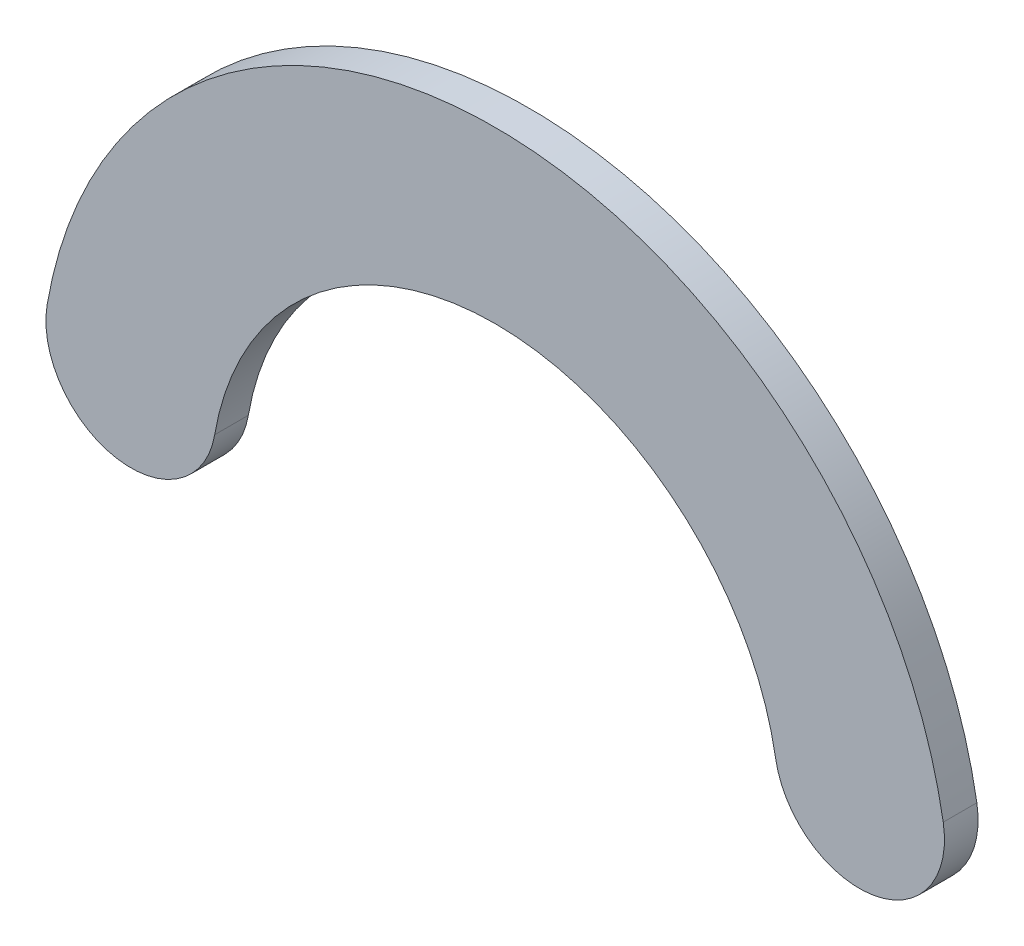
ISO-10303-21;
HEADER;
FILE_DESCRIPTION(('STEP AP214'),'2;1');
FILE_NAME('part.step','',(''),(''),'','','');
FILE_SCHEMA(('AUTOMOTIVE_DESIGN { 1 0 10303 214 1 1 1 1 }'));
ENDSEC;
DATA;
#1=APPLICATION_CONTEXT('core data for automotive mechanical design processes');
#2=APPLICATION_PROTOCOL_DEFINITION('international standard','automotive_design',2000,#1);
#3=PRODUCT_CONTEXT('',#1,'mechanical');
#4=PRODUCT('Part','Part','',(#3));
#5=PRODUCT_RELATED_PRODUCT_CATEGORY('part','',(#4));
#6=PRODUCT_DEFINITION_FORMATION('','',#4);
#7=PRODUCT_DEFINITION_CONTEXT('part definition',#1,'design');
#8=PRODUCT_DEFINITION('design','',#6,#7);
#9=PRODUCT_DEFINITION_SHAPE('','',#8);
#10=(LENGTH_UNIT() NAMED_UNIT(*) SI_UNIT(.MILLI.,.METRE.));
#11=(NAMED_UNIT(*) PLANE_ANGLE_UNIT() SI_UNIT($,.RADIAN.));
#12=(NAMED_UNIT(*) SI_UNIT($,.STERADIAN.) SOLID_ANGLE_UNIT());
#13=UNCERTAINTY_MEASURE_WITH_UNIT(LENGTH_MEASURE(1.E-05),#10,'distance_accuracy_value','');
#14=(GEOMETRIC_REPRESENTATION_CONTEXT(3) GLOBAL_UNCERTAINTY_ASSIGNED_CONTEXT((#13)) GLOBAL_UNIT_ASSIGNED_CONTEXT((#10,
#11,#12)) REPRESENTATION_CONTEXT('',''));
#15=CARTESIAN_POINT('',(0.,0.,0.));
#16=DIRECTION('',(0.,0.,1.));
#17=DIRECTION('',(1.,0.,0.));
#18=AXIS2_PLACEMENT_3D('',#15,#16,#17);
#19=CARTESIAN_POINT('',(70.9227290232849,12.3320617397998,5.));
#20=DIRECTION('',(0.,0.,-1.));
#21=DIRECTION('',(-1.,0.,0.));
#22=AXIS2_PLACEMENT_3D('',#19,#20,#21);
#23=CYLINDRICAL_SURFACE('',#22,12.6377037803664);
#24=CARTESIAN_POINT('',(70.9227290232849,12.3320617397998,0.));
#25=DIRECTION('',(0.,0.,1.));
#26=DIRECTION('',(1.,0.,0.));
#27=AXIS2_PLACEMENT_3D('',#24,#25,#26);
#28=CIRCLE('',#27,12.6377037803664);
#29=CARTESIAN_POINT('',(58.4670074867854,10.1951111448002,0.));
#30=VERTEX_POINT('',#29);
#31=CARTESIAN_POINT('',(83.3784505597845,14.4690123347995,0.));
#32=VERTEX_POINT('',#31);
#33=EDGE_CURVE('E147',#30,#32,#28,.T.);
#34=ORIENTED_EDGE('',*,*,#33,.T.);
#35=DIRECTION('',(0.,0.,-1.));
#36=VECTOR('',#35,1.);
#37=CARTESIAN_POINT('',(83.3784505597845,14.4690123347995,5.));
#38=LINE('',#37,#36);
#39=CARTESIAN_POINT('',(83.3784505597845,14.4690123347995,5.));
#40=VERTEX_POINT('',#39);
#41=EDGE_CURVE('E11',#40,#32,#38,.T.);
#42=ORIENTED_EDGE('',*,*,#41,.F.);
#43=CARTESIAN_POINT('',(70.9227290232849,12.3320617397998,5.));
#44=DIRECTION('',(0.,0.,1.));
#45=DIRECTION('',(1.,0.,0.));
#46=AXIS2_PLACEMENT_3D('',#43,#44,#45);
#47=CIRCLE('',#46,12.6377037803664);
#48=CARTESIAN_POINT('',(58.4670074867854,10.1951111448002,5.));
#49=VERTEX_POINT('',#48);
#50=EDGE_CURVE('E151',#49,#40,#47,.T.);
#51=ORIENTED_EDGE('',*,*,#50,.F.);
#52=DIRECTION('',(0.,0.,-1.));
#53=VECTOR('',#52,1.);
#54=CARTESIAN_POINT('',(58.4670074867854,10.1951111448002,5.));
#55=LINE('',#54,#53);
#56=EDGE_CURVE('E157',#49,#30,#55,.T.);
#57=ORIENTED_EDGE('',*,*,#56,.T.);
#58=EDGE_LOOP('',(#34,#42,#51,#57));
#59=FACE_BOUND('',#58,.T.);
#60=ADVANCED_FACE('F39',(#59),#23,.T.);
#61=CARTESIAN_POINT('',(16.7688926876421,3.04122520015393,5.));
#62=DIRECTION('',(0.,0.,-1.));
#63=DIRECTION('',(-1.,0.,0.));
#64=AXIS2_PLACEMENT_3D('',#61,#62,#63);
#65=CYLINDRICAL_SURFACE('',#64,67.5827457175058);
#66=CARTESIAN_POINT('',(16.7688926876421,3.04122520015393,0.));
#67=DIRECTION('',(0.,0.,1.));
#68=DIRECTION('',(1.,0.,0.));
#69=AXIS2_PLACEMENT_3D('',#66,#67,#68);
#70=CIRCLE('',#69,67.5827457175058);
#71=CARTESIAN_POINT('',(-49.8406651845002,14.4690123347995,0.));
#72=VERTEX_POINT('',#71);
#73=EDGE_CURVE('E160',#32,#72,#70,.T.);
#74=ORIENTED_EDGE('',*,*,#73,.T.);
#75=DIRECTION('',(0.,0.,-1.));
#76=VECTOR('',#75,1.);
#77=CARTESIAN_POINT('',(-49.8406651845002,14.4690123347995,5.));
#78=LINE('',#77,#76);
#79=CARTESIAN_POINT('',(-49.8406651845002,14.4690123347995,5.));
#80=VERTEX_POINT('',#79);
#81=EDGE_CURVE('E46',#80,#72,#78,.T.);
#82=ORIENTED_EDGE('',*,*,#81,.F.);
#83=CARTESIAN_POINT('',(16.7688926876421,3.04122520015393,5.));
#84=DIRECTION('',(0.,0.,1.));
#85=DIRECTION('',(1.,0.,0.));
#86=AXIS2_PLACEMENT_3D('',#83,#84,#85);
#87=CIRCLE('',#86,67.5827457175058);
#88=EDGE_CURVE('E90',#40,#80,#87,.T.);
#89=ORIENTED_EDGE('',*,*,#88,.F.);
#90=ORIENTED_EDGE('',*,*,#41,.T.);
#91=EDGE_LOOP('',(#74,#82,#89,#90));
#92=FACE_BOUND('',#91,.T.);
#93=ADVANCED_FACE('F188',(#92),#65,.T.);
#94=CARTESIAN_POINT('',(-37.3849436480007,12.3320617397998,5.));
#95=DIRECTION('',(0.,0.,-1.));
#96=DIRECTION('',(-1.,0.,0.));
#97=AXIS2_PLACEMENT_3D('',#94,#95,#96);
#98=CYLINDRICAL_SURFACE('',#97,12.6377037803664);
#99=CARTESIAN_POINT('',(-37.3849436480007,12.3320617397998,0.));
#100=DIRECTION('',(0.,0.,1.));
#101=DIRECTION('',(1.,0.,0.));
#102=AXIS2_PLACEMENT_3D('',#99,#100,#101);
#103=CIRCLE('',#102,12.6377037803664);
#104=CARTESIAN_POINT('',(-24.9292221115011,10.1951111448002,0.));
#105=VERTEX_POINT('',#104);
#106=EDGE_CURVE('E162',#72,#105,#103,.T.);
#107=ORIENTED_EDGE('',*,*,#106,.T.);
#108=DIRECTION('',(0.,0.,-1.));
#109=VECTOR('',#108,1.);
#110=CARTESIAN_POINT('',(-24.9292221115011,10.1951111448002,5.));
#111=LINE('',#110,#109);
#112=CARTESIAN_POINT('',(-24.9292221115011,10.1951111448002,5.));
#113=VERTEX_POINT('',#112);
#114=EDGE_CURVE('E166',#113,#105,#111,.T.);
#115=ORIENTED_EDGE('',*,*,#114,.F.);
#116=CARTESIAN_POINT('',(-37.3849436480007,12.3320617397998,5.));
#117=DIRECTION('',(0.,0.,1.));
#118=DIRECTION('',(1.,0.,0.));
#119=AXIS2_PLACEMENT_3D('',#116,#117,#118);
#120=CIRCLE('',#119,12.6377037803664);
#121=EDGE_CURVE('E154',#80,#113,#120,.T.);
#122=ORIENTED_EDGE('',*,*,#121,.F.);
#123=ORIENTED_EDGE('',*,*,#81,.T.);
#124=EDGE_LOOP('',(#107,#115,#122,#123));
#125=FACE_BOUND('',#124,.T.);
#126=ADVANCED_FACE('F171',(#125),#98,.T.);
#127=CARTESIAN_POINT('',(16.7688926876421,3.04122520015393,5.));
#128=DIRECTION('',(0.,0.,-1.));
#129=DIRECTION('',(-1.,0.,0.));
#130=AXIS2_PLACEMENT_3D('',#127,#128,#129);
#131=CYLINDRICAL_SURFACE('',#130,42.307338156773);
#132=CARTESIAN_POINT('',(16.7688926876421,3.04122520015393,0.));
#133=DIRECTION('',(0.,0.,-1.));
#134=DIRECTION('',(1.,0.,0.));
#135=AXIS2_PLACEMENT_3D('',#132,#133,#134);
#136=CIRCLE('',#135,42.307338156773);
#137=EDGE_CURVE('E83',#105,#30,#136,.T.);
#138=ORIENTED_EDGE('',*,*,#137,.T.);
#139=ORIENTED_EDGE('',*,*,#56,.F.);
#140=CARTESIAN_POINT('',(16.7688926876421,3.04122520015393,5.));
#141=DIRECTION('',(0.,0.,-1.));
#142=DIRECTION('',(1.,0.,0.));
#143=AXIS2_PLACEMENT_3D('',#140,#141,#142);
#144=CIRCLE('',#143,42.307338156773);
#145=EDGE_CURVE('E62',#113,#49,#144,.T.);
#146=ORIENTED_EDGE('',*,*,#145,.F.);
#147=ORIENTED_EDGE('',*,*,#114,.T.);
#148=EDGE_LOOP('',(#138,#139,#146,#147));
#149=FACE_BOUND('',#148,.T.);
#150=ADVANCED_FACE('F179',(#149),#131,.F.);
#151=CARTESIAN_POINT('',(43.8458108554635,7.68664346997689,5.));
#152=DIRECTION('',(0.,0.,1.));
#153=DIRECTION('',(1.,0.,0.));
#154=AXIS2_PLACEMENT_3D('',#151,#152,#153);
#155=PLANE('',#154);
#156=ORIENTED_EDGE('',*,*,#50,.T.);
#157=ORIENTED_EDGE('',*,*,#88,.T.);
#158=ORIENTED_EDGE('',*,*,#121,.T.);
#159=ORIENTED_EDGE('',*,*,#145,.T.);
#160=EDGE_LOOP('',(#156,#157,#158,#159));
#161=FACE_BOUND('',#160,.T.);
#162=ADVANCED_FACE('F181',(#161),#155,.T.);
#163=CARTESIAN_POINT('',(43.8458108554635,7.68664346997689,0.));
#164=DIRECTION('',(0.,0.,1.));
#165=DIRECTION('',(1.,0.,0.));
#166=AXIS2_PLACEMENT_3D('',#163,#164,#165);
#167=PLANE('',#166);
#168=CARTESIAN_POINT('',(16.7688926876421,3.80780695406795,0.));
#169=DIRECTION('',(0.,0.,-1.));
#170=DIRECTION('',(-1.,0.,0.));
#171=AXIS2_PLACEMENT_3D('',#168,#169,#170);
#172=CIRCLE('',#171,64.5028861300054);
#173=CARTESIAN_POINT('',(-46.9494386499588,13.8375911318124,0.));
#174=VERTEX_POINT('',#173);
#175=CARTESIAN_POINT('',(80.4872240252431,13.8375911318125,0.));
#176=VERTEX_POINT('',#175);
#177=EDGE_CURVE('E141',#174,#176,#172,.T.);
#178=ORIENTED_EDGE('',*,*,#177,.F.);
#179=CARTESIAN_POINT('',(-37.3849436480007,12.3320617397998,0.));
#180=DIRECTION('',(0.,0.,-1.));
#181=DIRECTION('',(-1.,0.,0.));
#182=AXIS2_PLACEMENT_3D('',#179,#180,#181);
#183=CIRCLE('',#182,9.68226127475893);
#184=CARTESIAN_POINT('',(-27.8204486460425,10.8265323477872,0.));
#185=VERTEX_POINT('',#184);
#186=EDGE_CURVE('E53',#185,#174,#183,.T.);
#187=ORIENTED_EDGE('',*,*,#186,.F.);
#188=CARTESIAN_POINT('',(16.7688926876421,3.80780695406795,0.));
#189=DIRECTION('',(0.,0.,1.));
#190=DIRECTION('',(-1.,0.,0.));
#191=AXIS2_PLACEMENT_3D('',#188,#189,#190);
#192=CIRCLE('',#191,45.1383635804875);
#193=CARTESIAN_POINT('',(61.3582340213268,10.8265323477873,0.));
#194=VERTEX_POINT('',#193);
#195=EDGE_CURVE('E132',#194,#185,#192,.T.);
#196=ORIENTED_EDGE('',*,*,#195,.F.);
#197=CARTESIAN_POINT('',(70.922729023285,12.3320617397999,0.));
#198=DIRECTION('',(0.,0.,-1.));
#199=DIRECTION('',(-1.,0.,0.));
#200=AXIS2_PLACEMENT_3D('',#197,#198,#199);
#201=CIRCLE('',#200,9.68226127475892);
#202=EDGE_CURVE('E135',#176,#194,#201,.T.);
#203=ORIENTED_EDGE('',*,*,#202,.F.);
#204=EDGE_LOOP('',(#178,#187,#196,#203));
#205=FACE_BOUND('',#204,.T.);
#206=ORIENTED_EDGE('',*,*,#33,.F.);
#207=ORIENTED_EDGE('',*,*,#137,.F.);
#208=ORIENTED_EDGE('',*,*,#106,.F.);
#209=ORIENTED_EDGE('',*,*,#73,.F.);
#210=EDGE_LOOP('',(#206,#207,#208,#209));
#211=FACE_BOUND('',#210,.T.);
#212=ADVANCED_FACE('F175',(#205,#211),#167,.F.);
#213=CARTESIAN_POINT('',(-37.3849436480007,12.3320617397998,3.5));
#214=DIRECTION('',(0.,0.,-1.));
#215=DIRECTION('',(-1.,0.,0.));
#216=AXIS2_PLACEMENT_3D('',#213,#214,#215);
#217=CYLINDRICAL_SURFACE('',#216,9.68226127475893);
#218=ORIENTED_EDGE('',*,*,#186,.T.);
#219=DIRECTION('',(0.,0.,-1.));
#220=VECTOR('',#219,1.);
#221=CARTESIAN_POINT('',(-46.9494386499588,13.8375911318124,3.5));
#222=LINE('',#221,#220);
#223=CARTESIAN_POINT('',(-46.9494386499588,13.8375911318124,3.5));
#224=VERTEX_POINT('',#223);
#225=EDGE_CURVE('E110',#224,#174,#222,.T.);
#226=ORIENTED_EDGE('',*,*,#225,.F.);
#227=CARTESIAN_POINT('',(-37.3849436480007,12.3320617397998,3.5));
#228=DIRECTION('',(0.,0.,-1.));
#229=DIRECTION('',(-1.,0.,0.));
#230=AXIS2_PLACEMENT_3D('',#227,#228,#229);
#231=CIRCLE('',#230,9.68226127475893);
#232=CARTESIAN_POINT('',(-27.8204486460425,10.8265323477872,3.5));
#233=VERTEX_POINT('',#232);
#234=EDGE_CURVE('E114',#233,#224,#231,.T.);
#235=ORIENTED_EDGE('',*,*,#234,.F.);
#236=DIRECTION('',(0.,0.,-1.));
#237=VECTOR('',#236,1.);
#238=CARTESIAN_POINT('',(-27.8204486460425,10.8265323477872,3.5));
#239=LINE('',#238,#237);
#240=EDGE_CURVE('E145',#233,#185,#239,.T.);
#241=ORIENTED_EDGE('',*,*,#240,.T.);
#242=EDGE_LOOP('',(#218,#226,#235,#241));
#243=FACE_BOUND('',#242,.T.);
#244=ADVANCED_FACE('F112',(#243),#217,.F.);
#245=CARTESIAN_POINT('',(16.7688926876421,3.80780695406795,3.5));
#246=DIRECTION('',(0.,0.,-1.));
#247=DIRECTION('',(-1.,0.,0.));
#248=AXIS2_PLACEMENT_3D('',#245,#246,#247);
#249=CYLINDRICAL_SURFACE('',#248,45.1383635804875);
#250=ORIENTED_EDGE('',*,*,#195,.T.);
#251=ORIENTED_EDGE('',*,*,#240,.F.);
#252=CARTESIAN_POINT('',(16.7688926876421,3.80780695406795,3.5));
#253=DIRECTION('',(0.,0.,1.));
#254=DIRECTION('',(-1.,0.,0.));
#255=AXIS2_PLACEMENT_3D('',#252,#253,#254);
#256=CIRCLE('',#255,45.1383635804875);
#257=CARTESIAN_POINT('',(61.3582340213268,10.8265323477873,3.5));
#258=VERTEX_POINT('',#257);
#259=EDGE_CURVE('E120',#258,#233,#256,.T.);
#260=ORIENTED_EDGE('',*,*,#259,.F.);
#261=DIRECTION('',(0.,0.,-1.));
#262=VECTOR('',#261,1.);
#263=CARTESIAN_POINT('',(61.3582340213268,10.8265323477873,3.5));
#264=LINE('',#263,#262);
#265=EDGE_CURVE('E148',#258,#194,#264,.T.);
#266=ORIENTED_EDGE('',*,*,#265,.T.);
#267=EDGE_LOOP('',(#250,#251,#260,#266));
#268=FACE_BOUND('',#267,.T.);
#269=ADVANCED_FACE('F228',(#268),#249,.T.);
#270=CARTESIAN_POINT('',(70.922729023285,12.3320617397999,3.5));
#271=DIRECTION('',(0.,0.,-1.));
#272=DIRECTION('',(-1.,0.,0.));
#273=AXIS2_PLACEMENT_3D('',#270,#271,#272);
#274=CYLINDRICAL_SURFACE('',#273,9.68226127475892);
#275=ORIENTED_EDGE('',*,*,#202,.T.);
#276=ORIENTED_EDGE('',*,*,#265,.F.);
#277=CARTESIAN_POINT('',(70.922729023285,12.3320617397999,3.5));
#278=DIRECTION('',(0.,0.,-1.));
#279=DIRECTION('',(-1.,0.,0.));
#280=AXIS2_PLACEMENT_3D('',#277,#278,#279);
#281=CIRCLE('',#280,9.68226127475892);
#282=CARTESIAN_POINT('',(80.4872240252431,13.8375911318125,3.5));
#283=VERTEX_POINT('',#282);
#284=EDGE_CURVE('E128',#283,#258,#281,.T.);
#285=ORIENTED_EDGE('',*,*,#284,.F.);
#286=DIRECTION('',(0.,0.,-1.));
#287=VECTOR('',#286,1.);
#288=CARTESIAN_POINT('',(80.4872240252431,13.8375911318125,3.5));
#289=LINE('',#288,#287);
#290=EDGE_CURVE('E119',#283,#176,#289,.T.);
#291=ORIENTED_EDGE('',*,*,#290,.T.);
#292=EDGE_LOOP('',(#275,#276,#285,#291));
#293=FACE_BOUND('',#292,.T.);
#294=ADVANCED_FACE('F237',(#293),#274,.F.);
#295=CARTESIAN_POINT('',(16.7688926876421,3.80780695406795,3.5));
#296=DIRECTION('',(0.,0.,-1.));
#297=DIRECTION('',(-1.,0.,0.));
#298=AXIS2_PLACEMENT_3D('',#295,#296,#297);
#299=CYLINDRICAL_SURFACE('',#298,64.5028861300054);
#300=ORIENTED_EDGE('',*,*,#177,.T.);
#301=ORIENTED_EDGE('',*,*,#290,.F.);
#302=CARTESIAN_POINT('',(16.7688926876421,3.80780695406795,3.5));
#303=DIRECTION('',(0.,0.,-1.));
#304=DIRECTION('',(-1.,0.,0.));
#305=AXIS2_PLACEMENT_3D('',#302,#303,#304);
#306=CIRCLE('',#305,64.5028861300054);
#307=EDGE_CURVE('E123',#224,#283,#306,.T.);
#308=ORIENTED_EDGE('',*,*,#307,.F.);
#309=ORIENTED_EDGE('',*,*,#225,.T.);
#310=EDGE_LOOP('',(#300,#301,#308,#309));
#311=FACE_BOUND('',#310,.T.);
#312=ADVANCED_FACE('F124',(#311),#299,.F.);
#313=CARTESIAN_POINT('',(-10.3080254801793,8.06993434693389,3.5));
#314=DIRECTION('',(0.,0.,-1.));
#315=DIRECTION('',(-1.,0.,0.));
#316=AXIS2_PLACEMENT_3D('',#313,#314,#315);
#317=PLANE('',#316);
#318=ORIENTED_EDGE('',*,*,#234,.T.);
#319=ORIENTED_EDGE('',*,*,#307,.T.);
#320=ORIENTED_EDGE('',*,*,#284,.T.);
#321=ORIENTED_EDGE('',*,*,#259,.T.);
#322=EDGE_LOOP('',(#318,#319,#320,#321));
#323=FACE_BOUND('',#322,.T.);
#324=ADVANCED_FACE('F130',(#323),#317,.T.);
#325=CLOSED_SHELL('',(#60,#93,#126,#150,#162,#212,#244,#269,#294,#312,#324));
#326=MANIFOLD_SOLID_BREP('B2',#325);
#327=ADVANCED_BREP_SHAPE_REPRESENTATION('',(#18,#326),#14);
#328=SHAPE_DEFINITION_REPRESENTATION(#9,#327);
ENDSEC;
END-ISO-10303-21;
